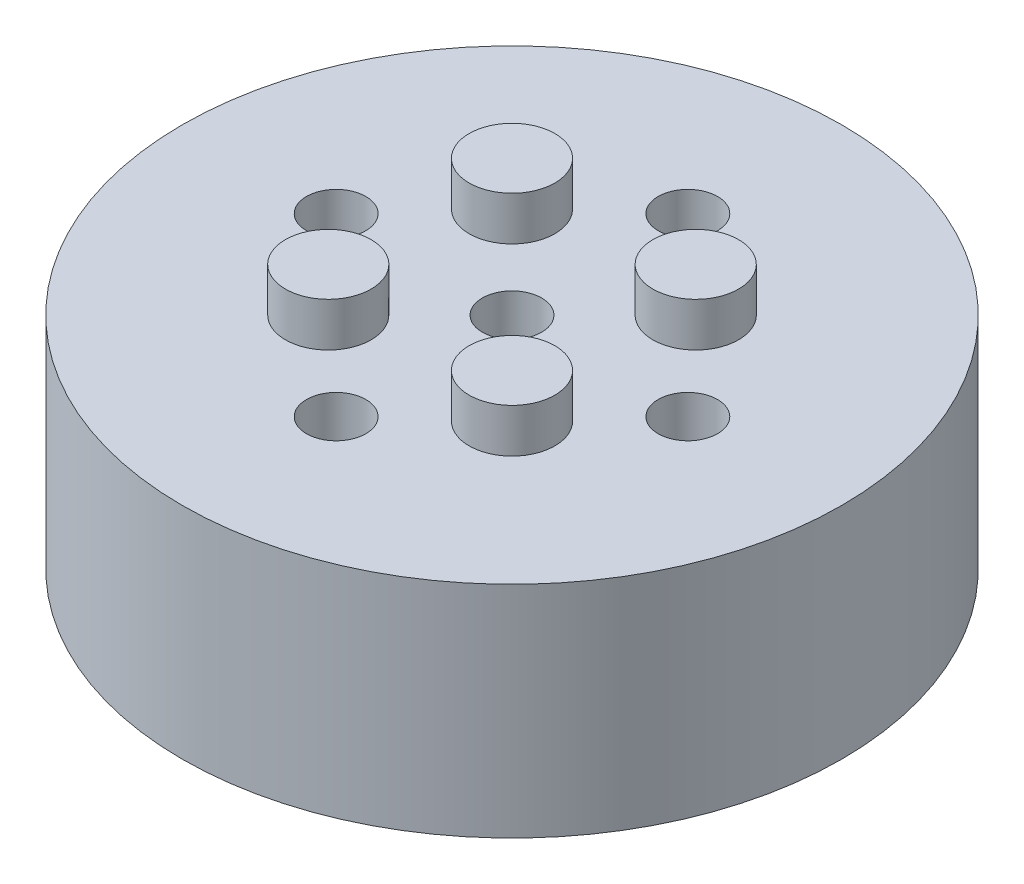
ISO-10303-21;
HEADER;
FILE_DESCRIPTION(('STEP AP214'),'2;1');
FILE_NAME('part.step','',(''),(''),'','','');
FILE_SCHEMA(('AUTOMOTIVE_DESIGN { 1 0 10303 214 1 1 1 1 }'));
ENDSEC;
DATA;
#1=APPLICATION_CONTEXT('core data for automotive mechanical design processes');
#2=APPLICATION_PROTOCOL_DEFINITION('international standard','automotive_design',2000,#1);
#3=PRODUCT_CONTEXT('',#1,'mechanical');
#4=PRODUCT('Part','Part','',(#3));
#5=PRODUCT_RELATED_PRODUCT_CATEGORY('part','',(#4));
#6=PRODUCT_DEFINITION_FORMATION('','',#4);
#7=PRODUCT_DEFINITION_CONTEXT('part definition',#1,'design');
#8=PRODUCT_DEFINITION('design','',#6,#7);
#9=PRODUCT_DEFINITION_SHAPE('','',#8);
#10=(LENGTH_UNIT() NAMED_UNIT(*) SI_UNIT(.MILLI.,.METRE.));
#11=(NAMED_UNIT(*) PLANE_ANGLE_UNIT() SI_UNIT($,.RADIAN.));
#12=(NAMED_UNIT(*) SI_UNIT($,.STERADIAN.) SOLID_ANGLE_UNIT());
#13=UNCERTAINTY_MEASURE_WITH_UNIT(LENGTH_MEASURE(1.E-05),#10,'distance_accuracy_value','');
#14=(GEOMETRIC_REPRESENTATION_CONTEXT(3) GLOBAL_UNCERTAINTY_ASSIGNED_CONTEXT((#13)) GLOBAL_UNIT_ASSIGNED_CONTEXT((#10,
#11,#12)) REPRESENTATION_CONTEXT('',''));
#15=CARTESIAN_POINT('',(0.,0.,0.));
#16=DIRECTION('',(0.,0.,1.));
#17=DIRECTION('',(1.,0.,0.));
#18=AXIS2_PLACEMENT_3D('',#15,#16,#17);
#19=CARTESIAN_POINT('',(0.,2.,0.));
#20=DIRECTION('',(0.,1.,0.));
#21=DIRECTION('',(0.,0.,1.));
#22=AXIS2_PLACEMENT_3D('',#19,#20,#21);
#23=PLANE('',#22);
#24=CARTESIAN_POINT('',(8.,2.,0.));
#25=DIRECTION('',(0.,-1.,0.));
#26=DIRECTION('',(-1.,0.,0.));
#27=AXIS2_PLACEMENT_3D('',#24,#25,#26);
#28=CIRCLE('',#27,1.35);
#29=CARTESIAN_POINT('',(6.65,2.,0.));
#30=VERTEX_POINT('',#29);
#31=EDGE_CURVE('E354',#30,#30,#28,.T.);
#32=ORIENTED_EDGE('',*,*,#31,.F.);
#33=EDGE_LOOP('',(#32));
#34=FACE_BOUND('',#33,.T.);
#35=DIRECTION('',(-1.,0.,0.));
#36=VECTOR('',#35,1.);
#37=CARTESIAN_POINT('',(10.55,2.,2.));
#38=LINE('',#37,#36);
#39=CARTESIAN_POINT('',(10.55,2.,2.));
#40=VERTEX_POINT('',#39);
#41=CARTESIAN_POINT('',(2.23606797749979,2.,2.));
#42=VERTEX_POINT('',#41);
#43=EDGE_CURVE('E297',#40,#42,#38,.T.);
#44=ORIENTED_EDGE('',*,*,#43,.T.);
#45=CARTESIAN_POINT('',(0.,2.,0.));
#46=DIRECTION('',(0.,1.,0.));
#47=DIRECTION('',(0.,0.,1.));
#48=AXIS2_PLACEMENT_3D('',#45,#46,#47);
#49=CIRCLE('',#48,3.);
#50=CARTESIAN_POINT('',(2.14242852856285,2.,-2.1));
#51=VERTEX_POINT('',#50);
#52=EDGE_CURVE('E11',#42,#51,#49,.T.);
#53=ORIENTED_EDGE('',*,*,#52,.T.);
#54=DIRECTION('',(-1.,0.,0.));
#55=VECTOR('',#54,1.);
#56=CARTESIAN_POINT('',(10.55,2.,-2.1));
#57=LINE('',#56,#55);
#58=CARTESIAN_POINT('',(10.55,2.,-2.1));
#59=VERTEX_POINT('',#58);
#60=EDGE_CURVE('E179',#59,#51,#57,.T.);
#61=ORIENTED_EDGE('',*,*,#60,.F.);
#62=DIRECTION('',(0.,0.,-1.));
#63=VECTOR('',#62,1.);
#64=CARTESIAN_POINT('',(10.55,2.,2.));
#65=LINE('',#64,#63);
#66=EDGE_CURVE('E299',#40,#59,#65,.T.);
#67=ORIENTED_EDGE('',*,*,#66,.F.);
#68=EDGE_LOOP('',(#44,#53,#61,#67));
#69=FACE_BOUND('',#68,.T.);
#70=ADVANCED_FACE('F37',(#34,#69),#23,.F.);
#71=CARTESIAN_POINT('',(0.,2.,-8.));
#72=DIRECTION('',(0.,-1.,0.));
#73=DIRECTION('',(0.,0.,1.));
#74=AXIS2_PLACEMENT_3D('',#71,#72,#73);
#75=CIRCLE('',#74,1.35);
#76=CARTESIAN_POINT('',(0.,2.,-6.65));
#77=VERTEX_POINT('',#76);
#78=EDGE_CURVE('E358',#77,#77,#75,.T.);
#79=ORIENTED_EDGE('',*,*,#78,.F.);
#80=EDGE_LOOP('',(#79));
#81=FACE_BOUND('',#80,.T.);
#82=DIRECTION('',(0.,0.,1.));
#83=VECTOR('',#82,1.);
#84=CARTESIAN_POINT('',(2.05,2.,-10.6));
#85=LINE('',#84,#83);
#86=CARTESIAN_POINT('',(2.05,2.,-10.6));
#87=VERTEX_POINT('',#86);
#88=CARTESIAN_POINT('',(2.04999999999999,2.,-2.19031961138096));
#89=VERTEX_POINT('',#88);
#90=EDGE_CURVE('E177',#87,#89,#85,.T.);
#91=ORIENTED_EDGE('',*,*,#90,.T.);
#92=CARTESIAN_POINT('',(-2.05,2.,-2.19031961138095));
#93=VERTEX_POINT('',#92);
#94=EDGE_CURVE('E46',#89,#93,#49,.T.);
#95=ORIENTED_EDGE('',*,*,#94,.T.);
#96=DIRECTION('',(0.,0.,1.));
#97=VECTOR('',#96,1.);
#98=CARTESIAN_POINT('',(-2.05,2.,-10.6));
#99=LINE('',#98,#97);
#100=CARTESIAN_POINT('',(-2.05,2.,-10.6));
#101=VERTEX_POINT('',#100);
#102=EDGE_CURVE('E189',#101,#93,#99,.T.);
#103=ORIENTED_EDGE('',*,*,#102,.F.);
#104=DIRECTION('',(-1.,0.,0.));
#105=VECTOR('',#104,1.);
#106=CARTESIAN_POINT('',(2.05,2.,-10.6));
#107=LINE('',#106,#105);
#108=EDGE_CURVE('E183',#87,#101,#107,.T.);
#109=ORIENTED_EDGE('',*,*,#108,.F.);
#110=EDGE_LOOP('',(#91,#95,#103,#109));
#111=FACE_BOUND('',#110,.T.);
#112=ADVANCED_FACE('F182',(#81,#111),#23,.F.);
#113=CARTESIAN_POINT('',(-8.,2.,0.));
#114=DIRECTION('',(0.,-1.,0.));
#115=DIRECTION('',(1.,0.,0.));
#116=AXIS2_PLACEMENT_3D('',#113,#114,#115);
#117=CIRCLE('',#116,1.35);
#118=CARTESIAN_POINT('',(-6.65,2.,0.));
#119=VERTEX_POINT('',#118);
#120=EDGE_CURVE('E351',#119,#119,#117,.T.);
#121=ORIENTED_EDGE('',*,*,#120,.F.);
#122=EDGE_LOOP('',(#121));
#123=FACE_BOUND('',#122,.T.);
#124=DIRECTION('',(1.,0.,0.));
#125=VECTOR('',#124,1.);
#126=CARTESIAN_POINT('',(-10.55,2.,-2.1));
#127=LINE('',#126,#125);
#128=CARTESIAN_POINT('',(-10.55,2.,-2.1));
#129=VERTEX_POINT('',#128);
#130=CARTESIAN_POINT('',(-2.14242852856286,2.,-2.1));
#131=VERTEX_POINT('',#130);
#132=EDGE_CURVE('E192',#129,#131,#127,.T.);
#133=ORIENTED_EDGE('',*,*,#132,.T.);
#134=CARTESIAN_POINT('',(-2.23606797749979,2.,2.));
#135=VERTEX_POINT('',#134);
#136=EDGE_CURVE('E163',#131,#135,#49,.T.);
#137=ORIENTED_EDGE('',*,*,#136,.T.);
#138=DIRECTION('',(1.,0.,0.));
#139=VECTOR('',#138,1.);
#140=CARTESIAN_POINT('',(-10.55,2.,2.));
#141=LINE('',#140,#139);
#142=CARTESIAN_POINT('',(-10.55,2.,2.));
#143=VERTEX_POINT('',#142);
#144=EDGE_CURVE('E277',#143,#135,#141,.T.);
#145=ORIENTED_EDGE('',*,*,#144,.F.);
#146=DIRECTION('',(0.,0.,1.));
#147=VECTOR('',#146,1.);
#148=CARTESIAN_POINT('',(-10.55,2.,-2.1));
#149=LINE('',#148,#147);
#150=EDGE_CURVE('E195',#129,#143,#149,.T.);
#151=ORIENTED_EDGE('',*,*,#150,.F.);
#152=EDGE_LOOP('',(#133,#137,#145,#151));
#153=FACE_BOUND('',#152,.T.);
#154=ADVANCED_FACE('F275',(#123,#153),#23,.F.);
#155=CARTESIAN_POINT('',(0.,0.,0.));
#156=DIRECTION('',(0.,1.,0.));
#157=DIRECTION('',(0.,0.,1.));
#158=AXIS2_PLACEMENT_3D('',#155,#156,#157);
#159=PLANE('',#158);
#160=CARTESIAN_POINT('',(0.,0.,0.));
#161=DIRECTION('',(0.,1.,0.));
#162=DIRECTION('',(0.,0.,1.));
#163=AXIS2_PLACEMENT_3D('',#160,#161,#162);
#164=CIRCLE('',#163,15.);
#165=CARTESIAN_POINT('',(0.,0.,15.));
#166=VERTEX_POINT('',#165);
#167=EDGE_CURVE('E259',#166,#166,#164,.T.);
#168=ORIENTED_EDGE('',*,*,#167,.F.);
#169=EDGE_LOOP('',(#168));
#170=FACE_BOUND('',#169,.T.);
#171=DIRECTION('',(1.,0.,0.));
#172=VECTOR('',#171,1.);
#173=CARTESIAN_POINT('',(-10.55,0.,2.));
#174=LINE('',#173,#172);
#175=CARTESIAN_POINT('',(-10.55,0.,2.));
#176=VERTEX_POINT('',#175);
#177=CARTESIAN_POINT('',(-2.05,0.,2.));
#178=VERTEX_POINT('',#177);
#179=EDGE_CURVE('E62',#176,#178,#174,.T.);
#180=ORIENTED_EDGE('',*,*,#179,.T.);
#181=DIRECTION('',(0.,0.,-1.));
#182=VECTOR('',#181,1.);
#183=CARTESIAN_POINT('',(-2.05,0.,10.5));
#184=LINE('',#183,#182);
#185=CARTESIAN_POINT('',(-2.05,0.,10.5));
#186=VERTEX_POINT('',#185);
#187=EDGE_CURVE('E199',#186,#178,#184,.T.);
#188=ORIENTED_EDGE('',*,*,#187,.F.);
#189=DIRECTION('',(1.,0.,0.));
#190=VECTOR('',#189,1.);
#191=CARTESIAN_POINT('',(-2.05,0.,10.5));
#192=LINE('',#191,#190);
#193=CARTESIAN_POINT('',(2.05,0.,10.5));
#194=VERTEX_POINT('',#193);
#195=EDGE_CURVE('E203',#186,#194,#192,.T.);
#196=ORIENTED_EDGE('',*,*,#195,.T.);
#197=DIRECTION('',(0.,0.,-1.));
#198=VECTOR('',#197,1.);
#199=CARTESIAN_POINT('',(2.05,0.,10.5));
#200=LINE('',#199,#198);
#201=CARTESIAN_POINT('',(2.05,0.,2.));
#202=VERTEX_POINT('',#201);
#203=EDGE_CURVE('E206',#194,#202,#200,.T.);
#204=ORIENTED_EDGE('',*,*,#203,.T.);
#205=DIRECTION('',(-1.,0.,0.));
#206=VECTOR('',#205,1.);
#207=CARTESIAN_POINT('',(10.55,0.,2.));
#208=LINE('',#207,#206);
#209=CARTESIAN_POINT('',(10.55,0.,2.));
#210=VERTEX_POINT('',#209);
#211=EDGE_CURVE('E209',#210,#202,#208,.T.);
#212=ORIENTED_EDGE('',*,*,#211,.F.);
#213=DIRECTION('',(0.,0.,-1.));
#214=VECTOR('',#213,1.);
#215=CARTESIAN_POINT('',(10.55,0.,2.));
#216=LINE('',#215,#214);
#217=CARTESIAN_POINT('',(10.55,0.,-2.1));
#218=VERTEX_POINT('',#217);
#219=EDGE_CURVE('E212',#210,#218,#216,.T.);
#220=ORIENTED_EDGE('',*,*,#219,.T.);
#221=DIRECTION('',(-1.,0.,0.));
#222=VECTOR('',#221,1.);
#223=CARTESIAN_POINT('',(10.55,0.,-2.1));
#224=LINE('',#223,#222);
#225=CARTESIAN_POINT('',(2.04999999999999,0.,-2.1));
#226=VERTEX_POINT('',#225);
#227=EDGE_CURVE('E215',#218,#226,#224,.T.);
#228=ORIENTED_EDGE('',*,*,#227,.T.);
#229=DIRECTION('',(0.,0.,1.));
#230=VECTOR('',#229,1.);
#231=CARTESIAN_POINT('',(2.05,0.,-10.6));
#232=LINE('',#231,#230);
#233=CARTESIAN_POINT('',(2.05,0.,-10.6));
#234=VERTEX_POINT('',#233);
#235=EDGE_CURVE('E218',#234,#226,#232,.T.);
#236=ORIENTED_EDGE('',*,*,#235,.F.);
#237=DIRECTION('',(-1.,0.,0.));
#238=VECTOR('',#237,1.);
#239=CARTESIAN_POINT('',(2.05,0.,-10.6));
#240=LINE('',#239,#238);
#241=CARTESIAN_POINT('',(-2.05,0.,-10.6));
#242=VERTEX_POINT('',#241);
#243=EDGE_CURVE('E220',#234,#242,#240,.T.);
#244=ORIENTED_EDGE('',*,*,#243,.T.);
#245=DIRECTION('',(0.,0.,1.));
#246=VECTOR('',#245,1.);
#247=CARTESIAN_POINT('',(-2.05,0.,-10.6));
#248=LINE('',#247,#246);
#249=CARTESIAN_POINT('',(-2.05,0.,-2.1));
#250=VERTEX_POINT('',#249);
#251=EDGE_CURVE('E223',#242,#250,#248,.T.);
#252=ORIENTED_EDGE('',*,*,#251,.T.);
#253=DIRECTION('',(1.,0.,0.));
#254=VECTOR('',#253,1.);
#255=CARTESIAN_POINT('',(-10.55,0.,-2.1));
#256=LINE('',#255,#254);
#257=CARTESIAN_POINT('',(-10.55,0.,-2.1));
#258=VERTEX_POINT('',#257);
#259=EDGE_CURVE('E226',#258,#250,#256,.T.);
#260=ORIENTED_EDGE('',*,*,#259,.F.);
#261=DIRECTION('',(0.,0.,1.));
#262=VECTOR('',#261,1.);
#263=CARTESIAN_POINT('',(-10.55,0.,-2.1));
#264=LINE('',#263,#262);
#265=EDGE_CURVE('E229',#258,#176,#264,.T.);
#266=ORIENTED_EDGE('',*,*,#265,.T.);
#267=EDGE_LOOP('',(#180,#188,#196,#204,#212,#220,#228,#236,#244,#252,#260,#266));
#268=FACE_BOUND('',#267,.T.);
#269=ADVANCED_FACE('F391',(#170,#268),#159,.F.);
#270=CARTESIAN_POINT('',(0.,10.,0.));
#271=DIRECTION('',(0.,-1.,0.));
#272=DIRECTION('',(0.,0.,-1.));
#273=AXIS2_PLACEMENT_3D('',#270,#271,#272);
#274=CYLINDRICAL_SURFACE('',#273,15.);
#275=CARTESIAN_POINT('',(0.,10.,0.));
#276=DIRECTION('',(0.,1.,0.));
#277=DIRECTION('',(0.,0.,1.));
#278=AXIS2_PLACEMENT_3D('',#275,#276,#277);
#279=CIRCLE('',#278,15.);
#280=CARTESIAN_POINT('',(0.,10.,15.));
#281=VERTEX_POINT('',#280);
#282=EDGE_CURVE('E262',#281,#281,#279,.T.);
#283=ORIENTED_EDGE('',*,*,#282,.F.);
#284=EDGE_LOOP('',(#283));
#285=FACE_BOUND('',#284,.T.);
#286=ORIENTED_EDGE('',*,*,#167,.T.);
#287=EDGE_LOOP('',(#286));
#288=FACE_BOUND('',#287,.T.);
#289=ADVANCED_FACE('F39',(#285,#288),#274,.T.);
#290=CARTESIAN_POINT('',(0.,10.,0.));
#291=DIRECTION('',(0.,1.,0.));
#292=DIRECTION('',(0.,0.,1.));
#293=AXIS2_PLACEMENT_3D('',#290,#291,#292);
#294=PLANE('',#293);
#295=CARTESIAN_POINT('',(0.,10.,0.));
#296=DIRECTION('',(0.,1.,0.));
#297=DIRECTION('',(0.,0.,1.));
#298=AXIS2_PLACEMENT_3D('',#295,#296,#297);
#299=CIRCLE('',#298,1.35);
#300=CARTESIAN_POINT('',(0.,10.,1.35));
#301=VERTEX_POINT('',#300);
#302=EDGE_CURVE('E41',#301,#301,#299,.T.);
#303=ORIENTED_EDGE('',*,*,#302,.F.);
#304=EDGE_LOOP('',(#303));
#305=FACE_BOUND('',#304,.T.);
#306=CARTESIAN_POINT('',(4.17938840769894,10.,4.1793884076989));
#307=DIRECTION('',(0.,1.,0.));
#308=DIRECTION('',(-1.,0.,0.));
#309=AXIS2_PLACEMENT_3D('',#306,#307,#308);
#310=CIRCLE('',#309,1.95);
#311=CARTESIAN_POINT('',(2.22938840769894,10.,4.17938840769892));
#312=VERTEX_POINT('',#311);
#313=EDGE_CURVE('E339',#312,#312,#310,.T.);
#314=ORIENTED_EDGE('',*,*,#313,.F.);
#315=EDGE_LOOP('',(#314));
#316=FACE_BOUND('',#315,.T.);
#317=CARTESIAN_POINT('',(-4.17938840769894,10.,4.1793884076989));
#318=DIRECTION('',(0.,1.,0.));
#319=DIRECTION('',(0.,0.,-1.));
#320=AXIS2_PLACEMENT_3D('',#317,#318,#319);
#321=CIRCLE('',#320,1.95);
#322=CARTESIAN_POINT('',(-4.17938840769894,10.,2.2293884076989));
#323=VERTEX_POINT('',#322);
#324=EDGE_CURVE('E338',#323,#323,#321,.T.);
#325=ORIENTED_EDGE('',*,*,#324,.F.);
#326=EDGE_LOOP('',(#325));
#327=FACE_BOUND('',#326,.T.);
#328=CARTESIAN_POINT('',(-4.17938840769892,10.,-4.17938840769893));
#329=DIRECTION('',(0.,1.,0.));
#330=DIRECTION('',(1.,0.,0.));
#331=AXIS2_PLACEMENT_3D('',#328,#329,#330);
#332=CIRCLE('',#331,1.95);
#333=CARTESIAN_POINT('',(-2.22938840769891,10.,-4.17938840769893));
#334=VERTEX_POINT('',#333);
#335=EDGE_CURVE('E345',#334,#334,#332,.T.);
#336=ORIENTED_EDGE('',*,*,#335,.F.);
#337=EDGE_LOOP('',(#336));
#338=FACE_BOUND('',#337,.T.);
#339=CARTESIAN_POINT('',(8.,10.,0.));
#340=DIRECTION('',(0.,1.,0.));
#341=DIRECTION('',(0.,0.,1.));
#342=AXIS2_PLACEMENT_3D('',#339,#340,#341);
#343=CIRCLE('',#342,1.35);
#344=CARTESIAN_POINT('',(8.,10.,1.34999999999997));
#345=VERTEX_POINT('',#344);
#346=EDGE_CURVE('E368',#345,#345,#343,.T.);
#347=ORIENTED_EDGE('',*,*,#346,.F.);
#348=EDGE_LOOP('',(#347));
#349=FACE_BOUND('',#348,.T.);
#350=CARTESIAN_POINT('',(0.,10.,-8.));
#351=DIRECTION('',(0.,1.,0.));
#352=DIRECTION('',(0.,0.,1.));
#353=AXIS2_PLACEMENT_3D('',#350,#351,#352);
#354=CIRCLE('',#353,1.35);
#355=CARTESIAN_POINT('',(0.,10.,-6.65));
#356=VERTEX_POINT('',#355);
#357=EDGE_CURVE('E365',#356,#356,#354,.T.);
#358=ORIENTED_EDGE('',*,*,#357,.F.);
#359=EDGE_LOOP('',(#358));
#360=FACE_BOUND('',#359,.T.);
#361=CARTESIAN_POINT('',(-8.,10.,0.));
#362=DIRECTION('',(0.,1.,0.));
#363=DIRECTION('',(0.,0.,1.));
#364=AXIS2_PLACEMENT_3D('',#361,#362,#363);
#365=CIRCLE('',#364,1.35);
#366=CARTESIAN_POINT('',(-8.,10.,1.35000000000008));
#367=VERTEX_POINT('',#366);
#368=EDGE_CURVE('E357',#367,#367,#365,.T.);
#369=ORIENTED_EDGE('',*,*,#368,.F.);
#370=EDGE_LOOP('',(#369));
#371=FACE_BOUND('',#370,.T.);
#372=CARTESIAN_POINT('',(0.,10.,8.));
#373=DIRECTION('',(0.,1.,0.));
#374=DIRECTION('',(0.,0.,1.));
#375=AXIS2_PLACEMENT_3D('',#372,#373,#374);
#376=CIRCLE('',#375,1.35);
#377=CARTESIAN_POINT('',(0.,10.,9.35));
#378=VERTEX_POINT('',#377);
#379=EDGE_CURVE('E200',#378,#378,#376,.T.);
#380=ORIENTED_EDGE('',*,*,#379,.F.);
#381=EDGE_LOOP('',(#380));
#382=FACE_BOUND('',#381,.T.);
#383=CARTESIAN_POINT('',(4.17938840769894,10.,-4.1793884076989));
#384=DIRECTION('',(0.,1.,0.));
#385=DIRECTION('',(0.,0.,1.));
#386=AXIS2_PLACEMENT_3D('',#383,#384,#385);
#387=CIRCLE('',#386,1.95);
#388=CARTESIAN_POINT('',(4.17938840769894,10.,-2.2293884076989));
#389=VERTEX_POINT('',#388);
#390=EDGE_CURVE('E255',#389,#389,#387,.T.);
#391=ORIENTED_EDGE('',*,*,#390,.F.);
#392=EDGE_LOOP('',(#391));
#393=FACE_BOUND('',#392,.T.);
#394=ORIENTED_EDGE('',*,*,#282,.T.);
#395=EDGE_LOOP('',(#394));
#396=FACE_BOUND('',#395,.T.);
#397=ADVANCED_FACE('F379',(#305,#316,#327,#338,#349,#360,#371,#382,#393,#396),#294,.T.);
#398=CARTESIAN_POINT('',(4.17938840769894,12.,-4.1793884076989));
#399=DIRECTION('',(0.,-1.,0.));
#400=DIRECTION('',(0.,0.,-1.));
#401=AXIS2_PLACEMENT_3D('',#398,#399,#400);
#402=CYLINDRICAL_SURFACE('',#401,1.95);
#403=CARTESIAN_POINT('',(4.17938840769894,12.,-4.1793884076989));
#404=DIRECTION('',(0.,1.,0.));
#405=DIRECTION('',(0.,0.,1.));
#406=AXIS2_PLACEMENT_3D('',#403,#404,#405);
#407=CIRCLE('',#406,1.95);
#408=CARTESIAN_POINT('',(4.17938840769894,12.,-2.2293884076989));
#409=VERTEX_POINT('',#408);
#410=EDGE_CURVE('E256',#409,#409,#407,.T.);
#411=ORIENTED_EDGE('',*,*,#410,.F.);
#412=EDGE_LOOP('',(#411));
#413=FACE_BOUND('',#412,.T.);
#414=ORIENTED_EDGE('',*,*,#390,.T.);
#415=EDGE_LOOP('',(#414));
#416=FACE_BOUND('',#415,.T.);
#417=ADVANCED_FACE('F382',(#413,#416),#402,.T.);
#418=CARTESIAN_POINT('',(4.17938840769894,12.,-4.1793884076989));
#419=DIRECTION('',(0.,1.,0.));
#420=DIRECTION('',(0.,0.,1.));
#421=AXIS2_PLACEMENT_3D('',#418,#419,#420);
#422=PLANE('',#421);
#423=ORIENTED_EDGE('',*,*,#410,.T.);
#424=EDGE_LOOP('',(#423));
#425=FACE_BOUND('',#424,.T.);
#426=ADVANCED_FACE('F658',(#425),#422,.T.);
#427=CARTESIAN_POINT('',(-10.55,2.,2.));
#428=DIRECTION('',(0.,0.,-1.));
#429=DIRECTION('',(-1.,0.,0.));
#430=AXIS2_PLACEMENT_3D('',#427,#428,#429);
#431=PLANE('',#430);
#432=ORIENTED_EDGE('',*,*,#179,.F.);
#433=DIRECTION('',(0.,-1.,0.));
#434=VECTOR('',#433,1.);
#435=CARTESIAN_POINT('',(-10.55,2.,2.));
#436=LINE('',#435,#434);
#437=EDGE_CURVE('E197',#143,#176,#436,.T.);
#438=ORIENTED_EDGE('',*,*,#437,.F.);
#439=ORIENTED_EDGE('',*,*,#144,.T.);
#440=CARTESIAN_POINT('',(-2.05,2.,2.));
#441=VERTEX_POINT('',#440);
#442=EDGE_CURVE('E232',#135,#441,#141,.T.);
#443=ORIENTED_EDGE('',*,*,#442,.T.);
#444=DIRECTION('',(0.,-1.,0.));
#445=VECTOR('',#444,1.);
#446=CARTESIAN_POINT('',(-2.05,2.,2.));
#447=LINE('',#446,#445);
#448=EDGE_CURVE('E253',#441,#178,#447,.T.);
#449=ORIENTED_EDGE('',*,*,#448,.T.);
#450=EDGE_LOOP('',(#432,#438,#439,#443,#449));
#451=FACE_BOUND('',#450,.T.);
#452=ADVANCED_FACE('F282',(#451),#431,.T.);
#453=CARTESIAN_POINT('',(-2.05,2.,10.5));
#454=DIRECTION('',(-1.,0.,0.));
#455=DIRECTION('',(0.,0.,1.));
#456=AXIS2_PLACEMENT_3D('',#453,#454,#455);
#457=PLANE('',#456);
#458=ORIENTED_EDGE('',*,*,#187,.T.);
#459=ORIENTED_EDGE('',*,*,#448,.F.);
#460=DIRECTION('',(0.,0.,-1.));
#461=VECTOR('',#460,1.);
#462=CARTESIAN_POINT('',(-2.05,2.,10.5));
#463=LINE('',#462,#461);
#464=CARTESIAN_POINT('',(-2.05,2.,2.19031961138095));
#465=VERTEX_POINT('',#464);
#466=EDGE_CURVE('E284',#465,#441,#463,.T.);
#467=ORIENTED_EDGE('',*,*,#466,.F.);
#468=CARTESIAN_POINT('',(-2.05,2.,10.5));
#469=VERTEX_POINT('',#468);
#470=EDGE_CURVE('E286',#469,#465,#463,.T.);
#471=ORIENTED_EDGE('',*,*,#470,.F.);
#472=DIRECTION('',(0.,-1.,0.));
#473=VECTOR('',#472,1.);
#474=CARTESIAN_POINT('',(-2.05,2.,10.5));
#475=LINE('',#474,#473);
#476=EDGE_CURVE('E251',#469,#186,#475,.T.);
#477=ORIENTED_EDGE('',*,*,#476,.T.);
#478=EDGE_LOOP('',(#458,#459,#467,#471,#477));
#479=FACE_BOUND('',#478,.T.);
#480=ADVANCED_FACE('F327',(#479),#457,.F.);
#481=CARTESIAN_POINT('',(-2.05,2.,10.5));
#482=DIRECTION('',(0.,0.,-1.));
#483=DIRECTION('',(-1.,0.,0.));
#484=AXIS2_PLACEMENT_3D('',#481,#482,#483);
#485=PLANE('',#484);
#486=ORIENTED_EDGE('',*,*,#195,.F.);
#487=ORIENTED_EDGE('',*,*,#476,.F.);
#488=DIRECTION('',(1.,0.,0.));
#489=VECTOR('',#488,1.);
#490=CARTESIAN_POINT('',(-2.05,2.,10.5));
#491=LINE('',#490,#489);
#492=CARTESIAN_POINT('',(2.05,2.,10.5));
#493=VERTEX_POINT('',#492);
#494=EDGE_CURVE('E291',#469,#493,#491,.T.);
#495=ORIENTED_EDGE('',*,*,#494,.T.);
#496=DIRECTION('',(0.,-1.,0.));
#497=VECTOR('',#496,1.);
#498=CARTESIAN_POINT('',(2.05,2.,10.5));
#499=LINE('',#498,#497);
#500=EDGE_CURVE('E249',#493,#194,#499,.T.);
#501=ORIENTED_EDGE('',*,*,#500,.T.);
#502=EDGE_LOOP('',(#486,#487,#495,#501));
#503=FACE_BOUND('',#502,.T.);
#504=ADVANCED_FACE('F418',(#503),#485,.T.);
#505=CARTESIAN_POINT('',(2.05,2.,10.5));
#506=DIRECTION('',(-1.,0.,0.));
#507=DIRECTION('',(0.,0.,1.));
#508=AXIS2_PLACEMENT_3D('',#505,#506,#507);
#509=PLANE('',#508);
#510=ORIENTED_EDGE('',*,*,#203,.F.);
#511=ORIENTED_EDGE('',*,*,#500,.F.);
#512=DIRECTION('',(0.,0.,-1.));
#513=VECTOR('',#512,1.);
#514=CARTESIAN_POINT('',(2.05,2.,10.5));
#515=LINE('',#514,#513);
#516=CARTESIAN_POINT('',(2.05,2.,2.19031961138095));
#517=VERTEX_POINT('',#516);
#518=EDGE_CURVE('E294',#493,#517,#515,.T.);
#519=ORIENTED_EDGE('',*,*,#518,.T.);
#520=CARTESIAN_POINT('',(2.05,2.,2.));
#521=VERTEX_POINT('',#520);
#522=EDGE_CURVE('E293',#517,#521,#515,.T.);
#523=ORIENTED_EDGE('',*,*,#522,.T.);
#524=DIRECTION('',(0.,-1.,0.));
#525=VECTOR('',#524,1.);
#526=CARTESIAN_POINT('',(2.05,2.,2.));
#527=LINE('',#526,#525);
#528=EDGE_CURVE('E247',#521,#202,#527,.T.);
#529=ORIENTED_EDGE('',*,*,#528,.T.);
#530=EDGE_LOOP('',(#510,#511,#519,#523,#529));
#531=FACE_BOUND('',#530,.T.);
#532=ADVANCED_FACE('F319',(#531),#509,.T.);
#533=CARTESIAN_POINT('',(10.55,2.,2.));
#534=DIRECTION('',(0.,0.,1.));
#535=DIRECTION('',(1.,0.,0.));
#536=AXIS2_PLACEMENT_3D('',#533,#534,#535);
#537=PLANE('',#536);
#538=ORIENTED_EDGE('',*,*,#211,.T.);
#539=ORIENTED_EDGE('',*,*,#528,.F.);
#540=EDGE_CURVE('E296',#42,#521,#38,.T.);
#541=ORIENTED_EDGE('',*,*,#540,.F.);
#542=ORIENTED_EDGE('',*,*,#43,.F.);
#543=DIRECTION('',(0.,-1.,0.));
#544=VECTOR('',#543,1.);
#545=CARTESIAN_POINT('',(10.55,2.,2.));
#546=LINE('',#545,#544);
#547=EDGE_CURVE('E245',#40,#210,#546,.T.);
#548=ORIENTED_EDGE('',*,*,#547,.T.);
#549=EDGE_LOOP('',(#538,#539,#541,#542,#548));
#550=FACE_BOUND('',#549,.T.);
#551=ADVANCED_FACE('F313',(#550),#537,.F.);
#552=CARTESIAN_POINT('',(10.55,2.,2.));
#553=DIRECTION('',(-1.,0.,0.));
#554=DIRECTION('',(0.,0.,1.));
#555=AXIS2_PLACEMENT_3D('',#552,#553,#554);
#556=PLANE('',#555);
#557=ORIENTED_EDGE('',*,*,#219,.F.);
#558=ORIENTED_EDGE('',*,*,#547,.F.);
#559=ORIENTED_EDGE('',*,*,#66,.T.);
#560=DIRECTION('',(0.,-1.,0.));
#561=VECTOR('',#560,1.);
#562=CARTESIAN_POINT('',(10.55,2.,-2.1));
#563=LINE('',#562,#561);
#564=EDGE_CURVE('E243',#59,#218,#563,.T.);
#565=ORIENTED_EDGE('',*,*,#564,.T.);
#566=EDGE_LOOP('',(#557,#558,#559,#565));
#567=FACE_BOUND('',#566,.T.);
#568=ADVANCED_FACE('F417',(#567),#556,.T.);
#569=CARTESIAN_POINT('',(10.55,2.,-2.1));
#570=DIRECTION('',(0.,0.,1.));
#571=DIRECTION('',(1.,0.,0.));
#572=AXIS2_PLACEMENT_3D('',#569,#570,#571);
#573=PLANE('',#572);
#574=ORIENTED_EDGE('',*,*,#227,.F.);
#575=ORIENTED_EDGE('',*,*,#564,.F.);
#576=ORIENTED_EDGE('',*,*,#60,.T.);
#577=CARTESIAN_POINT('',(2.04999999999999,2.,-2.1));
#578=VERTEX_POINT('',#577);
#579=EDGE_CURVE('E169',#51,#578,#57,.T.);
#580=ORIENTED_EDGE('',*,*,#579,.T.);
#581=DIRECTION('',(0.,-1.,0.));
#582=VECTOR('',#581,1.);
#583=CARTESIAN_POINT('',(2.04999999999999,2.,-2.1));
#584=LINE('',#583,#582);
#585=EDGE_CURVE('E178',#578,#226,#584,.T.);
#586=ORIENTED_EDGE('',*,*,#585,.T.);
#587=EDGE_LOOP('',(#574,#575,#576,#580,#586));
#588=FACE_BOUND('',#587,.T.);
#589=ADVANCED_FACE('F307',(#588),#573,.T.);
#590=CARTESIAN_POINT('',(2.05,2.,-10.6));
#591=DIRECTION('',(1.,0.,0.));
#592=DIRECTION('',(0.,0.,-1.));
#593=AXIS2_PLACEMENT_3D('',#590,#591,#592);
#594=PLANE('',#593);
#595=ORIENTED_EDGE('',*,*,#235,.T.);
#596=ORIENTED_EDGE('',*,*,#585,.F.);
#597=EDGE_CURVE('E167',#89,#578,#85,.T.);
#598=ORIENTED_EDGE('',*,*,#597,.F.);
#599=ORIENTED_EDGE('',*,*,#90,.F.);
#600=DIRECTION('',(0.,-1.,0.));
#601=VECTOR('',#600,1.);
#602=CARTESIAN_POINT('',(2.05,2.,-10.6));
#603=LINE('',#602,#601);
#604=EDGE_CURVE('E240',#87,#234,#603,.T.);
#605=ORIENTED_EDGE('',*,*,#604,.T.);
#606=EDGE_LOOP('',(#595,#596,#598,#599,#605));
#607=FACE_BOUND('',#606,.T.);
#608=ADVANCED_FACE('F176',(#607),#594,.F.);
#609=CARTESIAN_POINT('',(2.05,2.,-10.6));
#610=DIRECTION('',(0.,0.,1.));
#611=DIRECTION('',(1.,0.,0.));
#612=AXIS2_PLACEMENT_3D('',#609,#610,#611);
#613=PLANE('',#612);
#614=ORIENTED_EDGE('',*,*,#243,.F.);
#615=ORIENTED_EDGE('',*,*,#604,.F.);
#616=ORIENTED_EDGE('',*,*,#108,.T.);
#617=DIRECTION('',(0.,-1.,0.));
#618=VECTOR('',#617,1.);
#619=CARTESIAN_POINT('',(-2.05,2.,-10.6));
#620=LINE('',#619,#618);
#621=EDGE_CURVE('E238',#101,#242,#620,.T.);
#622=ORIENTED_EDGE('',*,*,#621,.T.);
#623=EDGE_LOOP('',(#614,#615,#616,#622));
#624=FACE_BOUND('',#623,.T.);
#625=ADVANCED_FACE('F413',(#624),#613,.T.);
#626=CARTESIAN_POINT('',(-2.05,2.,-10.6));
#627=DIRECTION('',(1.,0.,0.));
#628=DIRECTION('',(0.,0.,-1.));
#629=AXIS2_PLACEMENT_3D('',#626,#627,#628);
#630=PLANE('',#629);
#631=ORIENTED_EDGE('',*,*,#251,.F.);
#632=ORIENTED_EDGE('',*,*,#621,.F.);
#633=ORIENTED_EDGE('',*,*,#102,.T.);
#634=CARTESIAN_POINT('',(-2.05,2.,-2.1));
#635=VERTEX_POINT('',#634);
#636=EDGE_CURVE('E184',#93,#635,#99,.T.);
#637=ORIENTED_EDGE('',*,*,#636,.T.);
#638=DIRECTION('',(0.,-1.,0.));
#639=VECTOR('',#638,1.);
#640=CARTESIAN_POINT('',(-2.05,2.,-2.1));
#641=LINE('',#640,#639);
#642=EDGE_CURVE('E236',#635,#250,#641,.T.);
#643=ORIENTED_EDGE('',*,*,#642,.T.);
#644=EDGE_LOOP('',(#631,#632,#633,#637,#643));
#645=FACE_BOUND('',#644,.T.);
#646=ADVANCED_FACE('F409',(#645),#630,.T.);
#647=CARTESIAN_POINT('',(-10.55,2.,-2.1));
#648=DIRECTION('',(0.,0.,-1.));
#649=DIRECTION('',(-1.,0.,0.));
#650=AXIS2_PLACEMENT_3D('',#647,#648,#649);
#651=PLANE('',#650);
#652=ORIENTED_EDGE('',*,*,#259,.T.);
#653=ORIENTED_EDGE('',*,*,#642,.F.);
#654=EDGE_CURVE('E191',#131,#635,#127,.T.);
#655=ORIENTED_EDGE('',*,*,#654,.F.);
#656=ORIENTED_EDGE('',*,*,#132,.F.);
#657=DIRECTION('',(0.,-1.,0.));
#658=VECTOR('',#657,1.);
#659=CARTESIAN_POINT('',(-10.55,2.,-2.1));
#660=LINE('',#659,#658);
#661=EDGE_CURVE('E234',#129,#258,#660,.T.);
#662=ORIENTED_EDGE('',*,*,#661,.T.);
#663=EDGE_LOOP('',(#652,#653,#655,#656,#662));
#664=FACE_BOUND('',#663,.T.);
#665=ADVANCED_FACE('F402',(#664),#651,.F.);
#666=CARTESIAN_POINT('',(-10.55,2.,-2.1));
#667=DIRECTION('',(1.,0.,0.));
#668=DIRECTION('',(0.,0.,-1.));
#669=AXIS2_PLACEMENT_3D('',#666,#667,#668);
#670=PLANE('',#669);
#671=ORIENTED_EDGE('',*,*,#265,.F.);
#672=ORIENTED_EDGE('',*,*,#661,.F.);
#673=ORIENTED_EDGE('',*,*,#150,.T.);
#674=ORIENTED_EDGE('',*,*,#437,.T.);
#675=EDGE_LOOP('',(#671,#672,#673,#674));
#676=FACE_BOUND('',#675,.T.);
#677=ADVANCED_FACE('F400',(#676),#670,.T.);
#678=CARTESIAN_POINT('',(0.,2.,8.));
#679=DIRECTION('',(0.,-1.,0.));
#680=DIRECTION('',(0.,0.,-1.));
#681=AXIS2_PLACEMENT_3D('',#678,#679,#680);
#682=CIRCLE('',#681,1.35);
#683=CARTESIAN_POINT('',(0.,2.,6.65));
#684=VERTEX_POINT('',#683);
#685=EDGE_CURVE('E370',#684,#684,#682,.T.);
#686=ORIENTED_EDGE('',*,*,#685,.F.);
#687=EDGE_LOOP('',(#686));
#688=FACE_BOUND('',#687,.T.);
#689=ORIENTED_EDGE('',*,*,#470,.T.);
#690=EDGE_CURVE('E47',#465,#517,#49,.T.);
#691=ORIENTED_EDGE('',*,*,#690,.T.);
#692=ORIENTED_EDGE('',*,*,#518,.F.);
#693=ORIENTED_EDGE('',*,*,#494,.F.);
#694=EDGE_LOOP('',(#689,#691,#692,#693));
#695=FACE_BOUND('',#694,.T.);
#696=ADVANCED_FACE('F322',(#688,#695),#23,.F.);
#697=CARTESIAN_POINT('',(0.,12.,8.));
#698=DIRECTION('',(0.,-1.,0.));
#699=DIRECTION('',(0.,0.,-1.));
#700=AXIS2_PLACEMENT_3D('',#697,#698,#699);
#701=CYLINDRICAL_SURFACE('',#700,1.35);
#702=ORIENTED_EDGE('',*,*,#379,.T.);
#703=EDGE_LOOP('',(#702));
#704=FACE_BOUND('',#703,.T.);
#705=ORIENTED_EDGE('',*,*,#685,.T.);
#706=EDGE_LOOP('',(#705));
#707=FACE_BOUND('',#706,.T.);
#708=ADVANCED_FACE('F377',(#704,#707),#701,.F.);
#709=CARTESIAN_POINT('',(-8.,12.,0.));
#710=DIRECTION('',(0.,-1.,0.));
#711=DIRECTION('',(0.,0.,-1.));
#712=AXIS2_PLACEMENT_3D('',#709,#710,#711);
#713=CYLINDRICAL_SURFACE('',#712,1.35);
#714=ORIENTED_EDGE('',*,*,#368,.T.);
#715=EDGE_LOOP('',(#714));
#716=FACE_BOUND('',#715,.T.);
#717=ORIENTED_EDGE('',*,*,#120,.T.);
#718=EDGE_LOOP('',(#717));
#719=FACE_BOUND('',#718,.T.);
#720=ADVANCED_FACE('F443',(#716,#719),#713,.F.);
#721=CARTESIAN_POINT('',(0.,12.,-8.));
#722=DIRECTION('',(0.,-1.,0.));
#723=DIRECTION('',(0.,0.,-1.));
#724=AXIS2_PLACEMENT_3D('',#721,#722,#723);
#725=CYLINDRICAL_SURFACE('',#724,1.35);
#726=ORIENTED_EDGE('',*,*,#357,.T.);
#727=EDGE_LOOP('',(#726));
#728=FACE_BOUND('',#727,.T.);
#729=ORIENTED_EDGE('',*,*,#78,.T.);
#730=EDGE_LOOP('',(#729));
#731=FACE_BOUND('',#730,.T.);
#732=ADVANCED_FACE('F451',(#728,#731),#725,.F.);
#733=CARTESIAN_POINT('',(8.,12.,0.));
#734=DIRECTION('',(0.,-1.,0.));
#735=DIRECTION('',(0.,0.,-1.));
#736=AXIS2_PLACEMENT_3D('',#733,#734,#735);
#737=CYLINDRICAL_SURFACE('',#736,1.35);
#738=ORIENTED_EDGE('',*,*,#346,.T.);
#739=EDGE_LOOP('',(#738));
#740=FACE_BOUND('',#739,.T.);
#741=ORIENTED_EDGE('',*,*,#31,.T.);
#742=EDGE_LOOP('',(#741));
#743=FACE_BOUND('',#742,.T.);
#744=ADVANCED_FACE('F457',(#740,#743),#737,.F.);
#745=CARTESIAN_POINT('',(-4.17938840769892,12.,-4.17938840769893));
#746=DIRECTION('',(0.,-1.,0.));
#747=DIRECTION('',(0.,0.,-1.));
#748=AXIS2_PLACEMENT_3D('',#745,#746,#747);
#749=CYLINDRICAL_SURFACE('',#748,1.95);
#750=CARTESIAN_POINT('',(-4.17938840769892,12.,-4.17938840769893));
#751=DIRECTION('',(0.,1.,0.));
#752=DIRECTION('',(1.,0.,0.));
#753=AXIS2_PLACEMENT_3D('',#750,#751,#752);
#754=CIRCLE('',#753,1.95);
#755=CARTESIAN_POINT('',(-2.22938840769891,12.,-4.17938840769893));
#756=VERTEX_POINT('',#755);
#757=EDGE_CURVE('E348',#756,#756,#754,.T.);
#758=ORIENTED_EDGE('',*,*,#757,.F.);
#759=EDGE_LOOP('',(#758));
#760=FACE_BOUND('',#759,.T.);
#761=ORIENTED_EDGE('',*,*,#335,.T.);
#762=EDGE_LOOP('',(#761));
#763=FACE_BOUND('',#762,.T.);
#764=ADVANCED_FACE('F463',(#760,#763),#749,.T.);
#765=CARTESIAN_POINT('',(-4.17938840769892,12.,-4.17938840769893));
#766=DIRECTION('',(0.,1.,0.));
#767=DIRECTION('',(1.,0.,0.));
#768=AXIS2_PLACEMENT_3D('',#765,#766,#767);
#769=PLANE('',#768);
#770=ORIENTED_EDGE('',*,*,#757,.T.);
#771=EDGE_LOOP('',(#770));
#772=FACE_BOUND('',#771,.T.);
#773=ADVANCED_FACE('F467',(#772),#769,.T.);
#774=CARTESIAN_POINT('',(-4.17938840769894,12.,4.1793884076989));
#775=DIRECTION('',(0.,-1.,0.));
#776=DIRECTION('',(0.,0.,-1.));
#777=AXIS2_PLACEMENT_3D('',#774,#775,#776);
#778=CYLINDRICAL_SURFACE('',#777,1.95);
#779=CARTESIAN_POINT('',(-4.17938840769894,12.,4.1793884076989));
#780=DIRECTION('',(0.,1.,0.));
#781=DIRECTION('',(0.,0.,-1.));
#782=AXIS2_PLACEMENT_3D('',#779,#780,#781);
#783=CIRCLE('',#782,1.95);
#784=CARTESIAN_POINT('',(-4.17938840769894,12.,2.2293884076989));
#785=VERTEX_POINT('',#784);
#786=EDGE_CURVE('E342',#785,#785,#783,.T.);
#787=ORIENTED_EDGE('',*,*,#786,.F.);
#788=EDGE_LOOP('',(#787));
#789=FACE_BOUND('',#788,.T.);
#790=ORIENTED_EDGE('',*,*,#324,.T.);
#791=EDGE_LOOP('',(#790));
#792=FACE_BOUND('',#791,.T.);
#793=ADVANCED_FACE('F471',(#789,#792),#778,.T.);
#794=CARTESIAN_POINT('',(-4.17938840769894,12.,4.1793884076989));
#795=DIRECTION('',(0.,1.,0.));
#796=DIRECTION('',(0.,0.,-1.));
#797=AXIS2_PLACEMENT_3D('',#794,#795,#796);
#798=PLANE('',#797);
#799=ORIENTED_EDGE('',*,*,#786,.T.);
#800=EDGE_LOOP('',(#799));
#801=FACE_BOUND('',#800,.T.);
#802=ADVANCED_FACE('F475',(#801),#798,.T.);
#803=CARTESIAN_POINT('',(4.17938840769894,12.,4.1793884076989));
#804=DIRECTION('',(0.,-1.,0.));
#805=DIRECTION('',(0.,0.,-1.));
#806=AXIS2_PLACEMENT_3D('',#803,#804,#805);
#807=CYLINDRICAL_SURFACE('',#806,1.95);
#808=CARTESIAN_POINT('',(4.17938840769894,12.,4.1793884076989));
#809=DIRECTION('',(0.,1.,0.));
#810=DIRECTION('',(-1.,0.,0.));
#811=AXIS2_PLACEMENT_3D('',#808,#809,#810);
#812=CIRCLE('',#811,1.95);
#813=CARTESIAN_POINT('',(2.22938840769894,12.,4.17938840769892));
#814=VERTEX_POINT('',#813);
#815=EDGE_CURVE('E335',#814,#814,#812,.T.);
#816=ORIENTED_EDGE('',*,*,#815,.F.);
#817=EDGE_LOOP('',(#816));
#818=FACE_BOUND('',#817,.T.);
#819=ORIENTED_EDGE('',*,*,#313,.T.);
#820=EDGE_LOOP('',(#819));
#821=FACE_BOUND('',#820,.T.);
#822=ADVANCED_FACE('F479',(#818,#821),#807,.T.);
#823=CARTESIAN_POINT('',(4.17938840769894,12.,4.1793884076989));
#824=DIRECTION('',(0.,1.,0.));
#825=DIRECTION('',(-1.,0.,0.));
#826=AXIS2_PLACEMENT_3D('',#823,#824,#825);
#827=PLANE('',#826);
#828=ORIENTED_EDGE('',*,*,#815,.T.);
#829=EDGE_LOOP('',(#828));
#830=FACE_BOUND('',#829,.T.);
#831=ADVANCED_FACE('F483',(#830),#827,.T.);
#832=CARTESIAN_POINT('',(0.,2.,0.));
#833=DIRECTION('',(0.,-1.,0.));
#834=DIRECTION('',(0.,0.,-1.));
#835=AXIS2_PLACEMENT_3D('',#832,#833,#834);
#836=PLANE('',#835);
#837=ORIENTED_EDGE('',*,*,#442,.F.);
#838=CARTESIAN_POINT('',(0.,2.,0.));
#839=DIRECTION('',(0.,-1.,0.));
#840=DIRECTION('',(0.,0.,-1.));
#841=AXIS2_PLACEMENT_3D('',#838,#839,#840);
#842=CIRCLE('',#841,3.);
#843=EDGE_CURVE('E331',#465,#135,#842,.T.);
#844=ORIENTED_EDGE('',*,*,#843,.F.);
#845=ORIENTED_EDGE('',*,*,#466,.T.);
#846=EDGE_LOOP('',(#837,#844,#845));
#847=FACE_BOUND('',#846,.T.);
#848=ADVANCED_FACE('F330',(#847),#836,.F.);
#849=ORIENTED_EDGE('',*,*,#522,.F.);
#850=EDGE_CURVE('E54',#42,#517,#842,.T.);
#851=ORIENTED_EDGE('',*,*,#850,.F.);
#852=ORIENTED_EDGE('',*,*,#540,.T.);
#853=EDGE_LOOP('',(#849,#851,#852));
#854=FACE_BOUND('',#853,.T.);
#855=ADVANCED_FACE('F316',(#854),#836,.F.);
#856=ORIENTED_EDGE('',*,*,#579,.F.);
#857=EDGE_CURVE('E156',#89,#51,#842,.T.);
#858=ORIENTED_EDGE('',*,*,#857,.F.);
#859=ORIENTED_EDGE('',*,*,#597,.T.);
#860=EDGE_LOOP('',(#856,#858,#859));
#861=FACE_BOUND('',#860,.T.);
#862=ADVANCED_FACE('F166',(#861),#836,.F.);
#863=CARTESIAN_POINT('',(0.,7.,0.));
#864=DIRECTION('',(0.,-1.,0.));
#865=DIRECTION('',(0.,0.,-1.));
#866=AXIS2_PLACEMENT_3D('',#863,#864,#865);
#867=CYLINDRICAL_SURFACE('',#866,3.);
#868=CARTESIAN_POINT('',(0.,7.,0.));
#869=DIRECTION('',(0.,-1.,0.));
#870=DIRECTION('',(0.,0.,-1.));
#871=AXIS2_PLACEMENT_3D('',#868,#869,#870);
#872=CIRCLE('',#871,3.);
#873=CARTESIAN_POINT('',(0.,7.,-3.));
#874=VERTEX_POINT('',#873);
#875=EDGE_CURVE('E170',#874,#874,#872,.T.);
#876=ORIENTED_EDGE('',*,*,#875,.F.);
#877=EDGE_LOOP('',(#876));
#878=FACE_BOUND('',#877,.T.);
#879=ORIENTED_EDGE('',*,*,#857,.T.);
#880=ORIENTED_EDGE('',*,*,#52,.F.);
#881=ORIENTED_EDGE('',*,*,#850,.T.);
#882=ORIENTED_EDGE('',*,*,#690,.F.);
#883=ORIENTED_EDGE('',*,*,#843,.T.);
#884=ORIENTED_EDGE('',*,*,#136,.F.);
#885=EDGE_CURVE('E158',#131,#93,#842,.T.);
#886=ORIENTED_EDGE('',*,*,#885,.T.);
#887=ORIENTED_EDGE('',*,*,#94,.F.);
#888=EDGE_LOOP('',(#879,#880,#881,#882,#883,#884,#886,#887));
#889=FACE_BOUND('',#888,.T.);
#890=ADVANCED_FACE('F155',(#878,#889),#867,.F.);
#891=CARTESIAN_POINT('',(0.,7.,0.));
#892=DIRECTION('',(0.,-1.,0.));
#893=DIRECTION('',(0.,0.,-1.));
#894=AXIS2_PLACEMENT_3D('',#891,#892,#893);
#895=PLANE('',#894);
#896=CARTESIAN_POINT('',(0.,7.,0.));
#897=DIRECTION('',(0.,-1.,0.));
#898=DIRECTION('',(0.,0.,-1.));
#899=AXIS2_PLACEMENT_3D('',#896,#897,#898);
#900=CIRCLE('',#899,1.35);
#901=CARTESIAN_POINT('',(0.,7.,-1.35));
#902=VERTEX_POINT('',#901);
#903=EDGE_CURVE('E507',#902,#902,#900,.T.);
#904=ORIENTED_EDGE('',*,*,#903,.F.);
#905=EDGE_LOOP('',(#904));
#906=FACE_BOUND('',#905,.T.);
#907=ORIENTED_EDGE('',*,*,#875,.T.);
#908=EDGE_LOOP('',(#907));
#909=FACE_BOUND('',#908,.T.);
#910=ADVANCED_FACE('F490',(#906,#909),#895,.T.);
#911=ORIENTED_EDGE('',*,*,#636,.F.);
#912=ORIENTED_EDGE('',*,*,#885,.F.);
#913=ORIENTED_EDGE('',*,*,#654,.T.);
#914=EDGE_LOOP('',(#911,#912,#913));
#915=FACE_BOUND('',#914,.T.);
#916=ADVANCED_FACE('F406',(#915),#836,.F.);
#917=CARTESIAN_POINT('',(0.,12.,0.));
#918=DIRECTION('',(0.,-1.,0.));
#919=DIRECTION('',(0.,0.,-1.));
#920=AXIS2_PLACEMENT_3D('',#917,#918,#919);
#921=CYLINDRICAL_SURFACE('',#920,1.35);
#922=ORIENTED_EDGE('',*,*,#302,.T.);
#923=EDGE_LOOP('',(#922));
#924=FACE_BOUND('',#923,.T.);
#925=ORIENTED_EDGE('',*,*,#903,.T.);
#926=EDGE_LOOP('',(#925));
#927=FACE_BOUND('',#926,.T.);
#928=ADVANCED_FACE('F494',(#924,#927),#921,.F.);
#929=CLOSED_SHELL('',(#70,#112,#154,#269,#289,#397,#417,#426,#452,#480,#504,#532,#551,#568,#589,
#608,#625,#646,#665,#677,#696,#708,#720,#732,#744,#764,#773,#793,#802,#822,#831,#848,#855,#862,
#890,#910,#916,#928));
#930=MANIFOLD_SOLID_BREP('B2',#929);
#931=ADVANCED_BREP_SHAPE_REPRESENTATION('',(#18,#930),#14);
#932=SHAPE_DEFINITION_REPRESENTATION(#9,#931);
ENDSEC;
END-ISO-10303-21;
